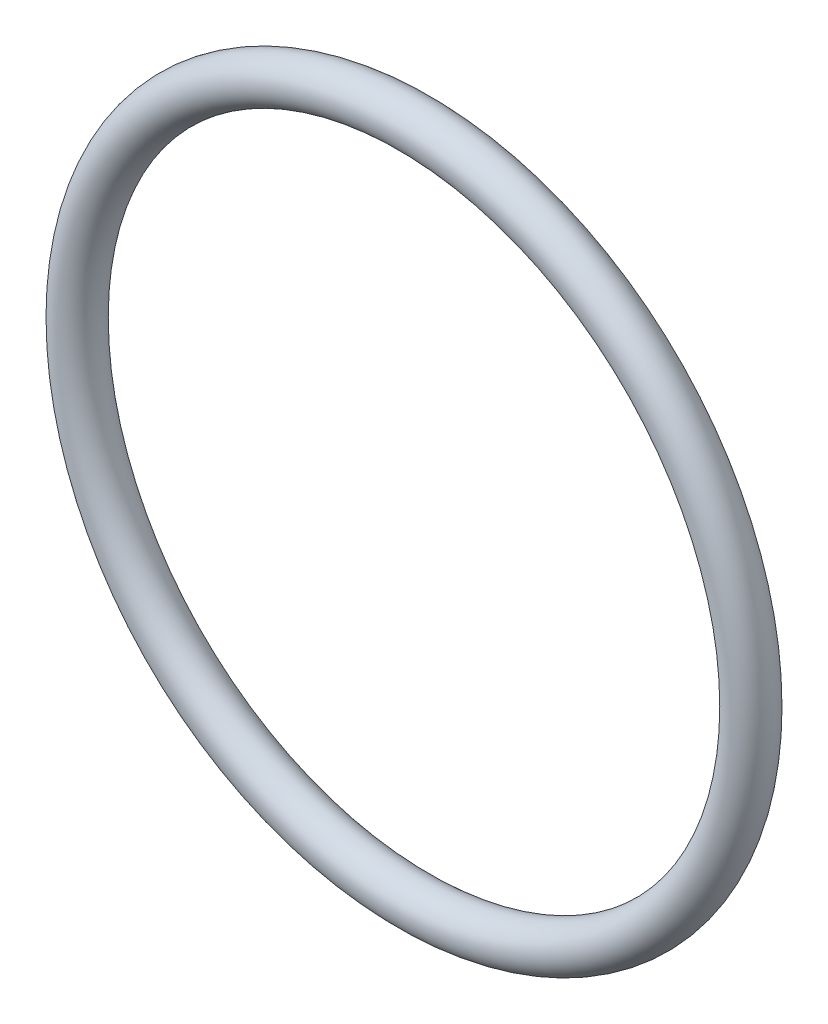
ISO-10303-21;
HEADER;
FILE_DESCRIPTION(('STEP AP214'),'2;1');
FILE_NAME('part.step','',(''),(''),'','','');
FILE_SCHEMA(('AUTOMOTIVE_DESIGN { 1 0 10303 214 1 1 1 1 }'));
ENDSEC;
DATA;
#1=APPLICATION_CONTEXT('core data for automotive mechanical design processes');
#2=APPLICATION_PROTOCOL_DEFINITION('international standard','automotive_design',2000,#1);
#3=PRODUCT_CONTEXT('',#1,'mechanical');
#4=PRODUCT('Part','Part','',(#3));
#5=PRODUCT_RELATED_PRODUCT_CATEGORY('part','',(#4));
#6=PRODUCT_DEFINITION_FORMATION('','',#4);
#7=PRODUCT_DEFINITION_CONTEXT('part definition',#1,'design');
#8=PRODUCT_DEFINITION('design','',#6,#7);
#9=PRODUCT_DEFINITION_SHAPE('','',#8);
#10=(LENGTH_UNIT() NAMED_UNIT(*) SI_UNIT(.MILLI.,.METRE.));
#11=(NAMED_UNIT(*) PLANE_ANGLE_UNIT() SI_UNIT($,.RADIAN.));
#12=(NAMED_UNIT(*) SI_UNIT($,.STERADIAN.) SOLID_ANGLE_UNIT());
#13=UNCERTAINTY_MEASURE_WITH_UNIT(LENGTH_MEASURE(1.E-05),#10,'distance_accuracy_value','');
#14=(GEOMETRIC_REPRESENTATION_CONTEXT(3) GLOBAL_UNCERTAINTY_ASSIGNED_CONTEXT((#13)) GLOBAL_UNIT_ASSIGNED_CONTEXT((#10,
#11,#12)) REPRESENTATION_CONTEXT('',''));
#15=CARTESIAN_POINT('',(0.,0.,0.));
#16=DIRECTION('',(0.,0.,1.));
#17=DIRECTION('',(1.,0.,0.));
#18=AXIS2_PLACEMENT_3D('',#15,#16,#17);
#19=CARTESIAN_POINT('',(0.,0.,0.));
#20=DIRECTION('',(0.,0.,-1.));
#21=DIRECTION('',(-1.,0.,0.));
#22=AXIS2_PLACEMENT_3D('',#19,#20,#21);
#23=TOROIDAL_SURFACE('',#22,19.431,1.27);
#24=CARTESIAN_POINT('',(-20.701,0.,0.));
#25=VERTEX_POINT('',#24);
#26=VERTEX_LOOP('',#25);
#27=FACE_BOUND('',#26,.T.);
#28=ADVANCED_FACE('F28',(#27),#23,.T.);
#29=CLOSED_SHELL('',(#28));
#30=MANIFOLD_SOLID_BREP('B2',#29);
#31=ADVANCED_BREP_SHAPE_REPRESENTATION('',(#18,#30),#14);
#32=SHAPE_DEFINITION_REPRESENTATION(#9,#31);
ENDSEC;
END-ISO-10303-21;
